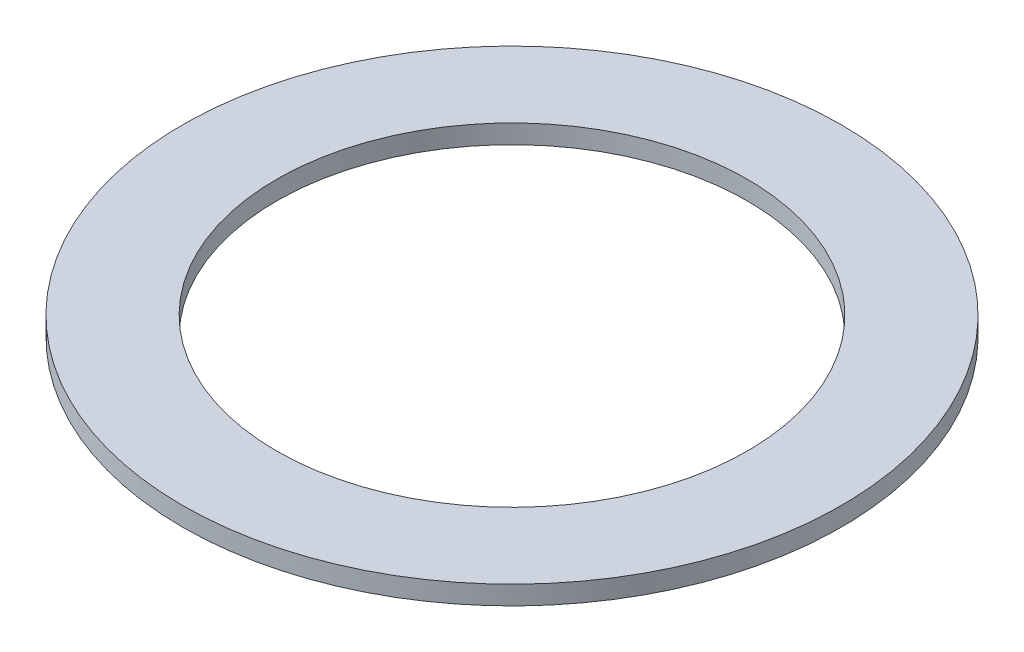
ISO-10303-21;
HEADER;
FILE_DESCRIPTION(('STEP AP214'),'2;1');
FILE_NAME('part.step','',(''),(''),'','','');
FILE_SCHEMA(('AUTOMOTIVE_DESIGN { 1 0 10303 214 1 1 1 1 }'));
ENDSEC;
DATA;
#1=APPLICATION_CONTEXT('core data for automotive mechanical design processes');
#2=APPLICATION_PROTOCOL_DEFINITION('international standard','automotive_design',2000,#1);
#3=PRODUCT_CONTEXT('',#1,'mechanical');
#4=PRODUCT('Part','Part','',(#3));
#5=PRODUCT_RELATED_PRODUCT_CATEGORY('part','',(#4));
#6=PRODUCT_DEFINITION_FORMATION('','',#4);
#7=PRODUCT_DEFINITION_CONTEXT('part definition',#1,'design');
#8=PRODUCT_DEFINITION('design','',#6,#7);
#9=PRODUCT_DEFINITION_SHAPE('','',#8);
#10=(LENGTH_UNIT() NAMED_UNIT(*) SI_UNIT(.MILLI.,.METRE.));
#11=(NAMED_UNIT(*) PLANE_ANGLE_UNIT() SI_UNIT($,.RADIAN.));
#12=(NAMED_UNIT(*) SI_UNIT($,.STERADIAN.) SOLID_ANGLE_UNIT());
#13=UNCERTAINTY_MEASURE_WITH_UNIT(LENGTH_MEASURE(1.E-05),#10,'distance_accuracy_value','');
#14=(GEOMETRIC_REPRESENTATION_CONTEXT(3) GLOBAL_UNCERTAINTY_ASSIGNED_CONTEXT((#13)) GLOBAL_UNIT_ASSIGNED_CONTEXT((#10,
#11,#12)) REPRESENTATION_CONTEXT('',''));
#15=CARTESIAN_POINT('',(0.,0.,0.));
#16=DIRECTION('',(0.,0.,1.));
#17=DIRECTION('',(1.,0.,0.));
#18=AXIS2_PLACEMENT_3D('',#15,#16,#17);
#19=CARTESIAN_POINT('',(0.,12.3438675323587,0.));
#20=DIRECTION('',(0.,1.,0.));
#21=DIRECTION('',(0.,0.,1.));
#22=AXIS2_PLACEMENT_3D('',#19,#20,#21);
#23=CYLINDRICAL_SURFACE('',#22,2.5);
#24=CARTESIAN_POINT('',(0.,-0.0999999999999994,0.));
#25=DIRECTION('',(0.,1.,0.));
#26=DIRECTION('',(0.,0.,1.));
#27=AXIS2_PLACEMENT_3D('',#24,#25,#26);
#28=CIRCLE('',#27,2.5);
#29=CARTESIAN_POINT('',(0.,-0.0999999999999994,2.5));
#30=VERTEX_POINT('',#29);
#31=EDGE_CURVE('E10',#30,#30,#28,.T.);
#32=ORIENTED_EDGE('',*,*,#31,.F.);
#33=EDGE_LOOP('',(#32));
#34=FACE_BOUND('',#33,.T.);
#35=CARTESIAN_POINT('',(0.,0.0999999999999994,0.));
#36=DIRECTION('',(0.,1.,0.));
#37=DIRECTION('',(0.,0.,1.));
#38=AXIS2_PLACEMENT_3D('',#35,#36,#37);
#39=CIRCLE('',#38,2.5);
#40=CARTESIAN_POINT('',(0.,0.0999999999999994,2.5));
#41=VERTEX_POINT('',#40);
#42=EDGE_CURVE('E51',#41,#41,#39,.T.);
#43=ORIENTED_EDGE('',*,*,#42,.T.);
#44=EDGE_LOOP('',(#43));
#45=FACE_BOUND('',#44,.T.);
#46=ADVANCED_FACE('F33',(#34,#45),#23,.F.);
#47=CARTESIAN_POINT('',(0.,-0.1,-2.5));
#48=DIRECTION('',(0.,1.,0.));
#49=DIRECTION('',(0.,0.,1.));
#50=AXIS2_PLACEMENT_3D('',#47,#48,#49);
#51=PLANE('',#50);
#52=CARTESIAN_POINT('',(0.,-0.0999999999999994,0.));
#53=DIRECTION('',(0.,1.,0.));
#54=DIRECTION('',(0.,0.,1.));
#55=AXIS2_PLACEMENT_3D('',#52,#53,#54);
#56=CIRCLE('',#55,3.5);
#57=CARTESIAN_POINT('',(0.,-0.0999999999999994,3.5));
#58=VERTEX_POINT('',#57);
#59=EDGE_CURVE('E40',#58,#58,#56,.T.);
#60=ORIENTED_EDGE('',*,*,#59,.F.);
#61=EDGE_LOOP('',(#60));
#62=FACE_BOUND('',#61,.T.);
#63=ORIENTED_EDGE('',*,*,#31,.T.);
#64=EDGE_LOOP('',(#63));
#65=FACE_BOUND('',#64,.T.);
#66=ADVANCED_FACE('F66',(#62,#65),#51,.F.);
#67=CARTESIAN_POINT('',(0.,12.3438675323587,0.));
#68=DIRECTION('',(0.,1.,0.));
#69=DIRECTION('',(0.,0.,1.));
#70=AXIS2_PLACEMENT_3D('',#67,#68,#69);
#71=CYLINDRICAL_SURFACE('',#70,3.5);
#72=CARTESIAN_POINT('',(0.,0.0999999999999994,0.));
#73=DIRECTION('',(0.,1.,0.));
#74=DIRECTION('',(0.,0.,1.));
#75=AXIS2_PLACEMENT_3D('',#72,#73,#74);
#76=CIRCLE('',#75,3.5);
#77=CARTESIAN_POINT('',(0.,0.0999999999999994,3.5));
#78=VERTEX_POINT('',#77);
#79=EDGE_CURVE('E47',#78,#78,#76,.T.);
#80=ORIENTED_EDGE('',*,*,#79,.F.);
#81=EDGE_LOOP('',(#80));
#82=FACE_BOUND('',#81,.T.);
#83=ORIENTED_EDGE('',*,*,#59,.T.);
#84=EDGE_LOOP('',(#83));
#85=FACE_BOUND('',#84,.T.);
#86=ADVANCED_FACE('F61',(#82,#85),#71,.T.);
#87=CARTESIAN_POINT('',(0.,0.1,-2.5));
#88=DIRECTION('',(0.,-1.,0.));
#89=DIRECTION('',(0.,0.,-1.));
#90=AXIS2_PLACEMENT_3D('',#87,#88,#89);
#91=PLANE('',#90);
#92=ORIENTED_EDGE('',*,*,#42,.F.);
#93=EDGE_LOOP('',(#92));
#94=FACE_BOUND('',#93,.T.);
#95=ORIENTED_EDGE('',*,*,#79,.T.);
#96=EDGE_LOOP('',(#95));
#97=FACE_BOUND('',#96,.T.);
#98=ADVANCED_FACE('F58',(#94,#97),#91,.F.);
#99=CLOSED_SHELL('',(#46,#66,#86,#98));
#100=MANIFOLD_SOLID_BREP('B2',#99);
#101=ADVANCED_BREP_SHAPE_REPRESENTATION('',(#18,#100),#14);
#102=SHAPE_DEFINITION_REPRESENTATION(#9,#101);
ENDSEC;
END-ISO-10303-21;
